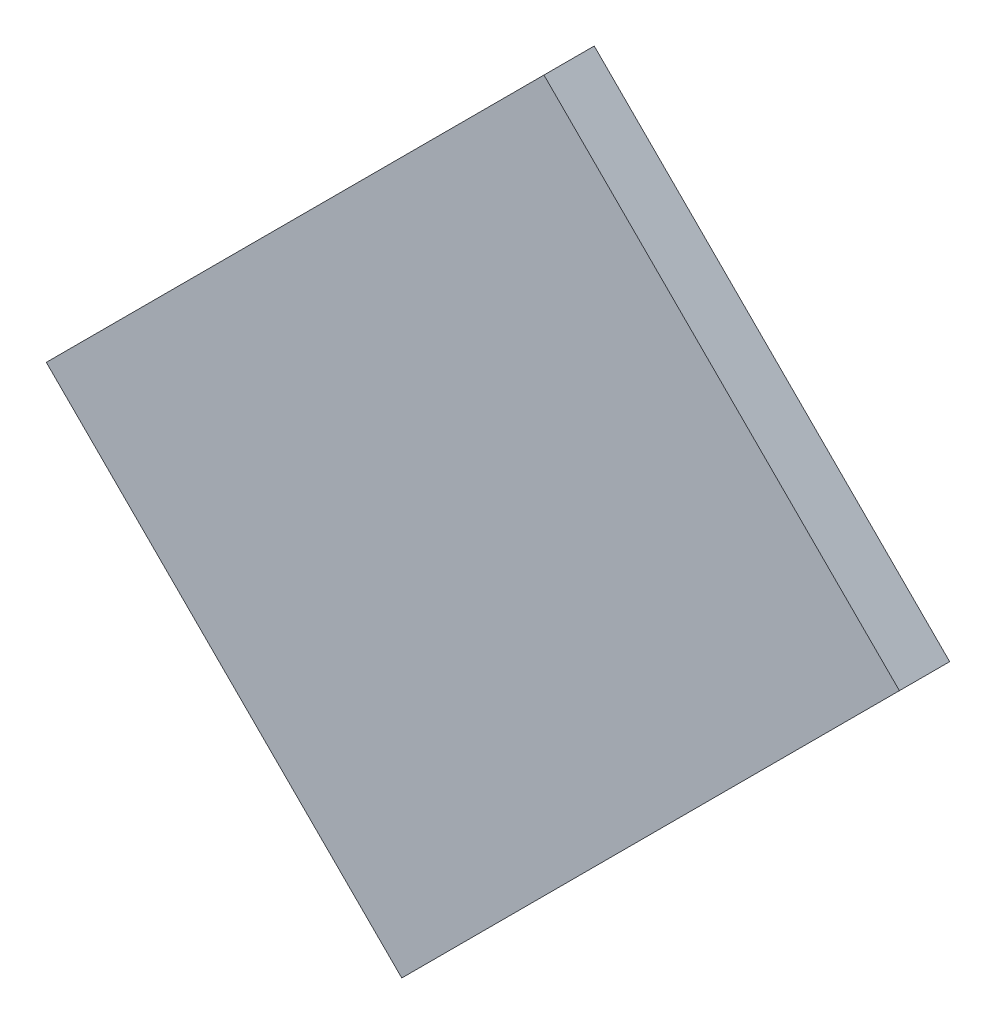
ISO-10303-21;
HEADER;
FILE_DESCRIPTION(('STEP AP214'),'2;1');
FILE_NAME('part.step','',(''),(''),'','','');
FILE_SCHEMA(('AUTOMOTIVE_DESIGN { 1 0 10303 214 1 1 1 1 }'));
ENDSEC;
DATA;
#1=APPLICATION_CONTEXT('core data for automotive mechanical design processes');
#2=APPLICATION_PROTOCOL_DEFINITION('international standard','automotive_design',2000,#1);
#3=PRODUCT_CONTEXT('',#1,'mechanical');
#4=PRODUCT('Part','Part','',(#3));
#5=PRODUCT_RELATED_PRODUCT_CATEGORY('part','',(#4));
#6=PRODUCT_DEFINITION_FORMATION('','',#4);
#7=PRODUCT_DEFINITION_CONTEXT('part definition',#1,'design');
#8=PRODUCT_DEFINITION('design','',#6,#7);
#9=PRODUCT_DEFINITION_SHAPE('','',#8);
#10=(LENGTH_UNIT() NAMED_UNIT(*) SI_UNIT(.MILLI.,.METRE.));
#11=(NAMED_UNIT(*) PLANE_ANGLE_UNIT() SI_UNIT($,.RADIAN.));
#12=(NAMED_UNIT(*) SI_UNIT($,.STERADIAN.) SOLID_ANGLE_UNIT());
#13=UNCERTAINTY_MEASURE_WITH_UNIT(LENGTH_MEASURE(1.E-05),#10,'distance_accuracy_value','');
#14=(GEOMETRIC_REPRESENTATION_CONTEXT(3) GLOBAL_UNCERTAINTY_ASSIGNED_CONTEXT((#13)) GLOBAL_UNIT_ASSIGNED_CONTEXT((#10,
#11,#12)) REPRESENTATION_CONTEXT('',''));
#15=CARTESIAN_POINT('',(0.,0.,0.));
#16=DIRECTION('',(0.,0.,1.));
#17=DIRECTION('',(1.,0.,0.));
#18=AXIS2_PLACEMENT_3D('',#15,#16,#17);
#19=CARTESIAN_POINT('',(100.05363389617,24.153784095819,0.5));
#20=DIRECTION('',(0.,0.,1.));
#21=DIRECTION('',(1.,0.,0.));
#22=AXIS2_PLACEMENT_3D('',#19,#20,#21);
#23=PLANE('',#22);
#24=DIRECTION('',(-0.707106781186548,0.707106781186548,0.));
#25=VECTOR('',#24,1.);
#26=CARTESIAN_POINT('',(100.05363389617,24.153784095819,0.5));
#27=LINE('',#26,#25);
#28=CARTESIAN_POINT('',(100.05363389617,24.153784095819,0.5));
#29=VERTEX_POINT('',#28);
#30=CARTESIAN_POINT('',(99.700080505585,24.507337486413,0.5));
#31=VERTEX_POINT('',#30);
#32=EDGE_CURVE('E93',#29,#31,#27,.T.);
#33=ORIENTED_EDGE('',*,*,#32,.F.);
#34=DIRECTION('',(0.707106781186548,0.707106781186548,0.));
#35=VECTOR('',#34,1.);
#36=CARTESIAN_POINT('',(100.05363389617,24.153784095819,0.5));
#37=LINE('',#36,#35);
#38=CARTESIAN_POINT('',(100.548608643,24.64875884265,0.5));
#39=VERTEX_POINT('',#38);
#40=EDGE_CURVE('E78',#29,#39,#37,.T.);
#41=ORIENTED_EDGE('',*,*,#40,.T.);
#42=DIRECTION('',(-0.707106781186548,0.707106781186548,0.));
#43=VECTOR('',#42,1.);
#44=CARTESIAN_POINT('',(100.548608643,24.64875884265,0.5));
#45=LINE('',#44,#43);
#46=CARTESIAN_POINT('',(100.19505525241,25.002312233243,0.5));
#47=VERTEX_POINT('',#46);
#48=EDGE_CURVE('E87',#39,#47,#45,.T.);
#49=ORIENTED_EDGE('',*,*,#48,.T.);
#50=DIRECTION('',(0.707106781186548,0.707106781186548,0.));
#51=VECTOR('',#50,1.);
#52=CARTESIAN_POINT('',(99.700080505585,24.507337486413,0.5));
#53=LINE('',#52,#51);
#54=EDGE_CURVE('E11',#31,#47,#53,.T.);
#55=ORIENTED_EDGE('',*,*,#54,.F.);
#56=EDGE_LOOP('',(#33,#41,#49,#55));
#57=FACE_BOUND('',#56,.T.);
#58=ADVANCED_FACE('F16',(#57),#23,.T.);
#59=CARTESIAN_POINT('',(100.05363389617,24.153784095819,0.45));
#60=DIRECTION('',(0.,0.,1.));
#61=DIRECTION('',(1.,0.,0.));
#62=AXIS2_PLACEMENT_3D('',#59,#60,#61);
#63=PLANE('',#62);
#64=DIRECTION('',(0.707106781186548,0.707106781186548,0.));
#65=VECTOR('',#64,1.);
#66=CARTESIAN_POINT('',(99.700080505585,24.507337486413,0.45));
#67=LINE('',#66,#65);
#68=CARTESIAN_POINT('',(99.700080505585,24.507337486413,0.45));
#69=VERTEX_POINT('',#68);
#70=CARTESIAN_POINT('',(100.19505525241,25.002312233243,0.45));
#71=VERTEX_POINT('',#70);
#72=EDGE_CURVE('E26',#69,#71,#67,.T.);
#73=ORIENTED_EDGE('',*,*,#72,.T.);
#74=DIRECTION('',(-0.707106781186548,0.707106781186548,0.));
#75=VECTOR('',#74,1.);
#76=CARTESIAN_POINT('',(100.548608643,24.64875884265,0.45));
#77=LINE('',#76,#75);
#78=CARTESIAN_POINT('',(100.548608643,24.64875884265,0.45));
#79=VERTEX_POINT('',#78);
#80=EDGE_CURVE('E131',#79,#71,#77,.T.);
#81=ORIENTED_EDGE('',*,*,#80,.F.);
#82=DIRECTION('',(0.707106781186548,0.707106781186548,0.));
#83=VECTOR('',#82,1.);
#84=CARTESIAN_POINT('',(100.05363389617,24.153784095819,0.45));
#85=LINE('',#84,#83);
#86=CARTESIAN_POINT('',(100.05363389617,24.153784095819,0.45));
#87=VERTEX_POINT('',#86);
#88=EDGE_CURVE('E60',#87,#79,#85,.T.);
#89=ORIENTED_EDGE('',*,*,#88,.F.);
#90=DIRECTION('',(-0.707106781186548,0.707106781186548,0.));
#91=VECTOR('',#90,1.);
#92=CARTESIAN_POINT('',(100.05363389617,24.153784095819,0.45));
#93=LINE('',#92,#91);
#94=EDGE_CURVE('E94',#87,#69,#93,.T.);
#95=ORIENTED_EDGE('',*,*,#94,.T.);
#96=EDGE_LOOP('',(#73,#81,#89,#95));
#97=FACE_BOUND('',#96,.T.);
#98=ADVANCED_FACE('F109',(#97),#63,.F.);
#99=CARTESIAN_POINT('',(99.700080505585,24.507337486413,0.45));
#100=DIRECTION('',(-0.707106781186548,0.707106781186548,0.));
#101=DIRECTION('',(0.,0.,1.));
#102=AXIS2_PLACEMENT_3D('',#99,#100,#101);
#103=PLANE('',#102);
#104=ORIENTED_EDGE('',*,*,#72,.F.);
#105=DIRECTION('',(0.,0.,1.));
#106=VECTOR('',#105,1.);
#107=CARTESIAN_POINT('',(99.700080505585,24.507337486413,0.45));
#108=LINE('',#107,#106);
#109=EDGE_CURVE('E98',#69,#31,#108,.T.);
#110=ORIENTED_EDGE('',*,*,#109,.T.);
#111=ORIENTED_EDGE('',*,*,#54,.T.);
#112=DIRECTION('',(0.,0.,1.));
#113=VECTOR('',#112,1.);
#114=CARTESIAN_POINT('',(100.19505525241,25.002312233243,0.45));
#115=LINE('',#114,#113);
#116=EDGE_CURVE('E20',#71,#47,#115,.T.);
#117=ORIENTED_EDGE('',*,*,#116,.F.);
#118=EDGE_LOOP('',(#104,#110,#111,#117));
#119=FACE_BOUND('',#118,.T.);
#120=ADVANCED_FACE('F18',(#119),#103,.T.);
#121=CARTESIAN_POINT('',(100.05363389617,24.153784095819,0.45));
#122=DIRECTION('',(-0.707106781186548,0.707106781186548,0.));
#123=DIRECTION('',(0.,0.,1.));
#124=AXIS2_PLACEMENT_3D('',#121,#122,#123);
#125=PLANE('',#124);
#126=DIRECTION('',(0.,0.,1.));
#127=VECTOR('',#126,1.);
#128=CARTESIAN_POINT('',(100.548608643,24.64875884265,0.45));
#129=LINE('',#128,#127);
#130=EDGE_CURVE('E84',#79,#39,#129,.T.);
#131=ORIENTED_EDGE('',*,*,#130,.T.);
#132=ORIENTED_EDGE('',*,*,#40,.F.);
#133=DIRECTION('',(0.,0.,1.));
#134=VECTOR('',#133,1.);
#135=CARTESIAN_POINT('',(100.05363389617,24.153784095819,0.45));
#136=LINE('',#135,#134);
#137=EDGE_CURVE('E81',#87,#29,#136,.T.);
#138=ORIENTED_EDGE('',*,*,#137,.F.);
#139=ORIENTED_EDGE('',*,*,#88,.T.);
#140=EDGE_LOOP('',(#131,#132,#138,#139));
#141=FACE_BOUND('',#140,.T.);
#142=ADVANCED_FACE('F80',(#141),#125,.F.);
#143=CARTESIAN_POINT('',(100.548608643,24.64875884265,0.45));
#144=DIRECTION('',(0.707106781186548,0.707106781186548,0.));
#145=DIRECTION('',(0.,0.,-1.));
#146=AXIS2_PLACEMENT_3D('',#143,#144,#145);
#147=PLANE('',#146);
#148=ORIENTED_EDGE('',*,*,#130,.F.);
#149=ORIENTED_EDGE('',*,*,#80,.T.);
#150=ORIENTED_EDGE('',*,*,#116,.T.);
#151=ORIENTED_EDGE('',*,*,#48,.F.);
#152=EDGE_LOOP('',(#148,#149,#150,#151));
#153=FACE_BOUND('',#152,.T.);
#154=ADVANCED_FACE('F116',(#153),#147,.T.);
#155=CARTESIAN_POINT('',(100.05363389617,24.153784095819,0.45));
#156=DIRECTION('',(0.707106781186548,0.707106781186548,0.));
#157=DIRECTION('',(0.,0.,-1.));
#158=AXIS2_PLACEMENT_3D('',#155,#156,#157);
#159=PLANE('',#158);
#160=ORIENTED_EDGE('',*,*,#32,.T.);
#161=ORIENTED_EDGE('',*,*,#109,.F.);
#162=ORIENTED_EDGE('',*,*,#94,.F.);
#163=ORIENTED_EDGE('',*,*,#137,.T.);
#164=EDGE_LOOP('',(#160,#161,#162,#163));
#165=FACE_BOUND('',#164,.T.);
#166=ADVANCED_FACE('F91',(#165),#159,.F.);
#167=CLOSED_SHELL('',(#58,#98,#120,#142,#154,#166));
#168=MANIFOLD_SOLID_BREP('B1',#167);
#169=ADVANCED_BREP_SHAPE_REPRESENTATION('',(#18,#168),#14);
#170=SHAPE_DEFINITION_REPRESENTATION(#9,#169);
ENDSEC;
END-ISO-10303-21;
